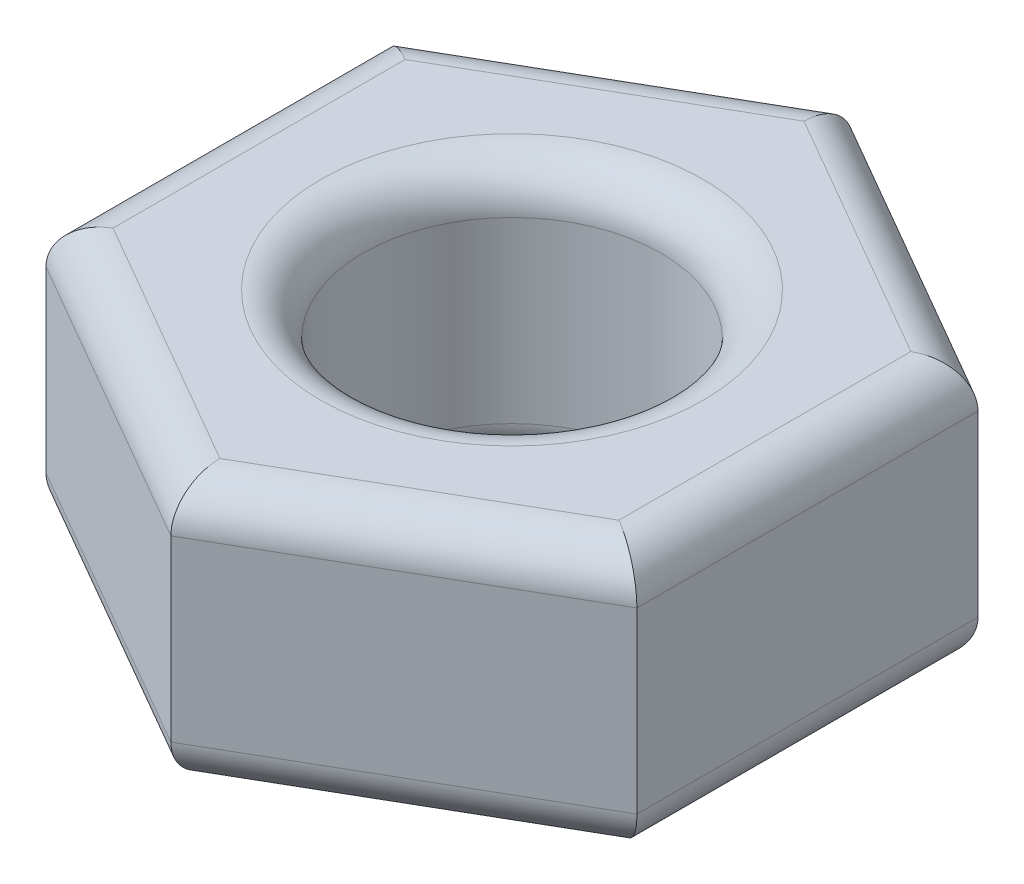
ISO-10303-21;
HEADER;
FILE_DESCRIPTION(('STEP AP214'),'2;1');
FILE_NAME('part.step','',(''),(''),'','','');
FILE_SCHEMA(('AUTOMOTIVE_DESIGN { 1 0 10303 214 1 1 1 1 }'));
ENDSEC;
DATA;
#1=APPLICATION_CONTEXT('core data for automotive mechanical design processes');
#2=APPLICATION_PROTOCOL_DEFINITION('international standard','automotive_design',2000,#1);
#3=PRODUCT_CONTEXT('',#1,'mechanical');
#4=PRODUCT('Part','Part','',(#3));
#5=PRODUCT_RELATED_PRODUCT_CATEGORY('part','',(#4));
#6=PRODUCT_DEFINITION_FORMATION('','',#4);
#7=PRODUCT_DEFINITION_CONTEXT('part definition',#1,'design');
#8=PRODUCT_DEFINITION('design','',#6,#7);
#9=PRODUCT_DEFINITION_SHAPE('','',#8);
#10=(LENGTH_UNIT() NAMED_UNIT(*) SI_UNIT(.MILLI.,.METRE.));
#11=(NAMED_UNIT(*) PLANE_ANGLE_UNIT() SI_UNIT($,.RADIAN.));
#12=(NAMED_UNIT(*) SI_UNIT($,.STERADIAN.) SOLID_ANGLE_UNIT());
#13=UNCERTAINTY_MEASURE_WITH_UNIT(LENGTH_MEASURE(1.E-05),#10,'distance_accuracy_value','');
#14=(GEOMETRIC_REPRESENTATION_CONTEXT(3) GLOBAL_UNCERTAINTY_ASSIGNED_CONTEXT((#13)) GLOBAL_UNIT_ASSIGNED_CONTEXT((#10,
#11,#12)) REPRESENTATION_CONTEXT('',''));
#15=CARTESIAN_POINT('',(0.,0.,0.));
#16=DIRECTION('',(0.,0.,1.));
#17=DIRECTION('',(1.,0.,0.));
#18=AXIS2_PLACEMENT_3D('',#15,#16,#17);
#19=CARTESIAN_POINT('',(0.,3.1,0.));
#20=DIRECTION('',(0.,1.,0.));
#21=DIRECTION('',(0.,0.,1.));
#22=AXIS2_PLACEMENT_3D('',#19,#20,#21);
#23=PLANE('',#22);
#24=CARTESIAN_POINT('',(0.,3.1,0.));
#25=DIRECTION('',(0.,1.,0.));
#26=DIRECTION('',(0.,0.,1.));
#27=AXIS2_PLACEMENT_3D('',#24,#25,#26);
#28=CIRCLE('',#27,2.25);
#29=CARTESIAN_POINT('',(0.,3.1,2.25));
#30=VERTEX_POINT('',#29);
#31=EDGE_CURVE('E148',#30,#30,#28,.F.);
#32=ORIENTED_EDGE('',*,*,#31,.T.);
#33=EDGE_LOOP('',(#32));
#34=FACE_BOUND('',#33,.T.);
#35=DIRECTION('',(-0.866025403784439,0.,0.5));
#36=VECTOR('',#35,1.);
#37=CARTESIAN_POINT('',(-3.225,3.1,-1.57327948354173));
#38=LINE('',#37,#36);
#39=CARTESIAN_POINT('',(0.,3.1,-3.43523410167828));
#40=VERTEX_POINT('',#39);
#41=CARTESIAN_POINT('',(-2.975,3.1,-1.71761705083914));
#42=VERTEX_POINT('',#41);
#43=EDGE_CURVE('E146',#40,#42,#38,.T.);
#44=ORIENTED_EDGE('',*,*,#43,.T.);
#45=DIRECTION('',(0.,0.,1.));
#46=VECTOR('',#45,1.);
#47=CARTESIAN_POINT('',(-2.975,3.1,2.00629218543395));
#48=LINE('',#47,#46);
#49=CARTESIAN_POINT('',(-2.975,3.1,1.71761705083914));
#50=VERTEX_POINT('',#49);
#51=EDGE_CURVE('E128',#42,#50,#48,.T.);
#52=ORIENTED_EDGE('',*,*,#51,.T.);
#53=DIRECTION('',(0.866025403784439,0.,0.5));
#54=VECTOR('',#53,1.);
#55=CARTESIAN_POINT('',(0.249999999999999,3.1,3.57957166897568));
#56=LINE('',#55,#54);
#57=CARTESIAN_POINT('',(0.,3.1,3.43523410167828));
#58=VERTEX_POINT('',#57);
#59=EDGE_CURVE('E136',#50,#58,#56,.T.);
#60=ORIENTED_EDGE('',*,*,#59,.T.);
#61=DIRECTION('',(0.866025403784438,0.,-0.5));
#62=VECTOR('',#61,1.);
#63=CARTESIAN_POINT('',(3.225,3.1,1.57327948354173));
#64=LINE('',#63,#62);
#65=CARTESIAN_POINT('',(2.975,3.1,1.71761705083914));
#66=VERTEX_POINT('',#65);
#67=EDGE_CURVE('E142',#58,#66,#64,.T.);
#68=ORIENTED_EDGE('',*,*,#67,.T.);
#69=DIRECTION('',(0.,0.,-1.));
#70=VECTOR('',#69,1.);
#71=CARTESIAN_POINT('',(2.975,3.1,-2.00629218543396));
#72=LINE('',#71,#70);
#73=CARTESIAN_POINT('',(2.975,3.1,-1.71761705083915));
#74=VERTEX_POINT('',#73);
#75=EDGE_CURVE('E256',#66,#74,#72,.T.);
#76=ORIENTED_EDGE('',*,*,#75,.T.);
#77=DIRECTION('',(-0.866025403784439,0.,-0.5));
#78=VECTOR('',#77,1.);
#79=CARTESIAN_POINT('',(-0.249999999999994,3.1,-3.57957166897568));
#80=LINE('',#79,#78);
#81=EDGE_CURVE('E153',#74,#40,#80,.T.);
#82=ORIENTED_EDGE('',*,*,#81,.T.);
#83=EDGE_LOOP('',(#44,#52,#60,#68,#76,#82));
#84=FACE_BOUND('',#83,.T.);
#85=ADVANCED_FACE('F32',(#34,#84),#23,.T.);
#86=CARTESIAN_POINT('',(0.,0.,0.));
#87=DIRECTION('',(0.,1.,0.));
#88=DIRECTION('',(0.,0.,1.));
#89=AXIS2_PLACEMENT_3D('',#86,#87,#88);
#90=PLANE('',#89);
#91=CARTESIAN_POINT('',(0.,0.,0.));
#92=DIRECTION('',(0.,1.,0.));
#93=DIRECTION('',(0.,0.,1.));
#94=AXIS2_PLACEMENT_3D('',#91,#92,#93);
#95=CIRCLE('',#94,2.25);
#96=CARTESIAN_POINT('',(0.,0.,2.25));
#97=VERTEX_POINT('',#96);
#98=EDGE_CURVE('E11',#97,#97,#95,.T.);
#99=ORIENTED_EDGE('',*,*,#98,.T.);
#100=EDGE_LOOP('',(#99));
#101=FACE_BOUND('',#100,.T.);
#102=DIRECTION('',(0.,0.,-1.));
#103=VECTOR('',#102,1.);
#104=CARTESIAN_POINT('',(2.975,0.,0.));
#105=LINE('',#104,#103);
#106=CARTESIAN_POINT('',(2.975,0.,-1.71761705083915));
#107=VERTEX_POINT('',#106);
#108=CARTESIAN_POINT('',(2.975,0.,1.71761705083914));
#109=VERTEX_POINT('',#108);
#110=EDGE_CURVE('E49',#107,#109,#105,.F.);
#111=ORIENTED_EDGE('',*,*,#110,.T.);
#112=DIRECTION('',(0.866025403784438,0.,-0.5));
#113=VECTOR('',#112,1.);
#114=CARTESIAN_POINT('',(1.4875,0.,2.5764255762587));
#115=LINE('',#114,#113);
#116=CARTESIAN_POINT('',(0.,0.,3.43523410167828));
#117=VERTEX_POINT('',#116);
#118=EDGE_CURVE('E41',#109,#117,#115,.F.);
#119=ORIENTED_EDGE('',*,*,#118,.T.);
#120=DIRECTION('',(0.866025403784439,0.,0.5));
#121=VECTOR('',#120,1.);
#122=CARTESIAN_POINT('',(-1.4875,0.,2.57642557625871));
#123=LINE('',#122,#121);
#124=CARTESIAN_POINT('',(-2.975,0.,1.71761705083914));
#125=VERTEX_POINT('',#124);
#126=EDGE_CURVE('E180',#117,#125,#123,.F.);
#127=ORIENTED_EDGE('',*,*,#126,.T.);
#128=DIRECTION('',(0.,0.,1.));
#129=VECTOR('',#128,1.);
#130=CARTESIAN_POINT('',(-2.975,0.,0.));
#131=LINE('',#130,#129);
#132=CARTESIAN_POINT('',(-2.975,0.,-1.71761705083914));
#133=VERTEX_POINT('',#132);
#134=EDGE_CURVE('E182',#125,#133,#131,.F.);
#135=ORIENTED_EDGE('',*,*,#134,.T.);
#136=DIRECTION('',(-0.866025403784439,0.,0.5));
#137=VECTOR('',#136,1.);
#138=CARTESIAN_POINT('',(-1.4875,0.,-2.57642557625871));
#139=LINE('',#138,#137);
#140=CARTESIAN_POINT('',(0.,0.,-3.43523410167828));
#141=VERTEX_POINT('',#140);
#142=EDGE_CURVE('E184',#133,#141,#139,.F.);
#143=ORIENTED_EDGE('',*,*,#142,.T.);
#144=DIRECTION('',(-0.866025403784439,0.,-0.5));
#145=VECTOR('',#144,1.);
#146=CARTESIAN_POINT('',(1.4875,0.,-2.57642557625871));
#147=LINE('',#146,#145);
#148=EDGE_CURVE('E54',#141,#107,#147,.F.);
#149=ORIENTED_EDGE('',*,*,#148,.T.);
#150=EDGE_LOOP('',(#111,#119,#127,#135,#143,#149));
#151=FACE_BOUND('',#150,.T.);
#152=ADVANCED_FACE('F225',(#101,#151),#90,.F.);
#153=CARTESIAN_POINT('',(-3.475,3.1,2.00629218543395));
#154=DIRECTION('',(0.5,0.,-0.866025403784438));
#155=DIRECTION('',(-0.866025403784439,0.,-0.5));
#156=AXIS2_PLACEMENT_3D('',#153,#154,#155);
#157=PLANE('',#156);
#158=DIRECTION('',(0.,-1.,0.));
#159=VECTOR('',#158,1.);
#160=CARTESIAN_POINT('',(0.,3.1,4.0125843708679));
#161=LINE('',#160,#159);
#162=CARTESIAN_POINT('',(0.,2.6,4.0125843708679));
#163=VERTEX_POINT('',#162);
#164=CARTESIAN_POINT('',(0.,0.500000000000001,4.0125843708679));
#165=VERTEX_POINT('',#164);
#166=EDGE_CURVE('E237',#163,#165,#161,.T.);
#167=ORIENTED_EDGE('',*,*,#166,.F.);
#168=DIRECTION('',(0.866025403784439,0.,0.5));
#169=VECTOR('',#168,1.);
#170=CARTESIAN_POINT('',(-3.475,2.6,2.00629218543395));
#171=LINE('',#170,#169);
#172=CARTESIAN_POINT('',(-3.475,2.6,2.00629218543395));
#173=VERTEX_POINT('',#172);
#174=EDGE_CURVE('E178',#163,#173,#171,.F.);
#175=ORIENTED_EDGE('',*,*,#174,.T.);
#176=DIRECTION('',(0.,-1.,0.));
#177=VECTOR('',#176,1.);
#178=CARTESIAN_POINT('',(-3.475,3.1,2.00629218543395));
#179=LINE('',#178,#177);
#180=CARTESIAN_POINT('',(-3.475,0.500000000000001,2.00629218543395));
#181=VERTEX_POINT('',#180);
#182=EDGE_CURVE('E200',#173,#181,#179,.T.);
#183=ORIENTED_EDGE('',*,*,#182,.T.);
#184=DIRECTION('',(0.866025403784439,0.,0.5));
#185=VECTOR('',#184,1.);
#186=CARTESIAN_POINT('',(-3.475,0.5,2.00629218543395));
#187=LINE('',#186,#185);
#188=EDGE_CURVE('E176',#181,#165,#187,.T.);
#189=ORIENTED_EDGE('',*,*,#188,.T.);
#190=EDGE_LOOP('',(#167,#175,#183,#189));
#191=FACE_BOUND('',#190,.T.);
#192=ADVANCED_FACE('F236',(#191),#157,.F.);
#193=CARTESIAN_POINT('',(0.,3.1,4.0125843708679));
#194=DIRECTION('',(-0.5,0.,-0.866025403784438));
#195=DIRECTION('',(-0.866025403784438,0.,0.5));
#196=AXIS2_PLACEMENT_3D('',#193,#194,#195);
#197=PLANE('',#196);
#198=DIRECTION('',(0.,-1.,0.));
#199=VECTOR('',#198,1.);
#200=CARTESIAN_POINT('',(3.475,3.1,2.00629218543395));
#201=LINE('',#200,#199);
#202=CARTESIAN_POINT('',(3.475,2.6,2.00629218543395));
#203=VERTEX_POINT('',#202);
#204=CARTESIAN_POINT('',(3.475,0.500000000000001,2.00629218543395));
#205=VERTEX_POINT('',#204);
#206=EDGE_CURVE('E245',#203,#205,#201,.T.);
#207=ORIENTED_EDGE('',*,*,#206,.F.);
#208=DIRECTION('',(0.866025403784438,0.,-0.5));
#209=VECTOR('',#208,1.);
#210=CARTESIAN_POINT('',(0.,2.6,4.0125843708679));
#211=LINE('',#210,#209);
#212=EDGE_CURVE('E174',#203,#163,#211,.F.);
#213=ORIENTED_EDGE('',*,*,#212,.T.);
#214=ORIENTED_EDGE('',*,*,#166,.T.);
#215=DIRECTION('',(0.866025403784438,0.,-0.5));
#216=VECTOR('',#215,1.);
#217=CARTESIAN_POINT('',(0.,0.5,4.0125843708679));
#218=LINE('',#217,#216);
#219=EDGE_CURVE('E171',#165,#205,#218,.T.);
#220=ORIENTED_EDGE('',*,*,#219,.T.);
#221=EDGE_LOOP('',(#207,#213,#214,#220));
#222=FACE_BOUND('',#221,.T.);
#223=ADVANCED_FACE('F241',(#222),#197,.F.);
#224=CARTESIAN_POINT('',(3.475,3.1,2.00629218543395));
#225=DIRECTION('',(-1.,0.,0.));
#226=DIRECTION('',(0.,0.,1.));
#227=AXIS2_PLACEMENT_3D('',#224,#225,#226);
#228=PLANE('',#227);
#229=DIRECTION('',(0.,-1.,0.));
#230=VECTOR('',#229,1.);
#231=CARTESIAN_POINT('',(3.475,3.1,-2.00629218543396));
#232=LINE('',#231,#230);
#233=CARTESIAN_POINT('',(3.475,2.6,-2.00629218543396));
#234=VERTEX_POINT('',#233);
#235=CARTESIAN_POINT('',(3.475,0.500000000000001,-2.00629218543396));
#236=VERTEX_POINT('',#235);
#237=EDGE_CURVE('E249',#234,#236,#232,.T.);
#238=ORIENTED_EDGE('',*,*,#237,.F.);
#239=DIRECTION('',(0.,0.,-1.));
#240=VECTOR('',#239,1.);
#241=CARTESIAN_POINT('',(3.475,2.6,2.00629218543395));
#242=LINE('',#241,#240);
#243=EDGE_CURVE('E169',#234,#203,#242,.F.);
#244=ORIENTED_EDGE('',*,*,#243,.T.);
#245=ORIENTED_EDGE('',*,*,#206,.T.);
#246=DIRECTION('',(0.,0.,-1.));
#247=VECTOR('',#246,1.);
#248=CARTESIAN_POINT('',(3.475,0.5,2.00629218543395));
#249=LINE('',#248,#247);
#250=EDGE_CURVE('E167',#205,#236,#249,.T.);
#251=ORIENTED_EDGE('',*,*,#250,.T.);
#252=EDGE_LOOP('',(#238,#244,#245,#251));
#253=FACE_BOUND('',#252,.T.);
#254=ADVANCED_FACE('F317',(#253),#228,.F.);
#255=CARTESIAN_POINT('',(3.475,3.1,-2.00629218543396));
#256=DIRECTION('',(-0.5,0.,0.866025403784439));
#257=DIRECTION('',(0.866025403784439,0.,0.5));
#258=AXIS2_PLACEMENT_3D('',#255,#256,#257);
#259=PLANE('',#258);
#260=DIRECTION('',(0.,-1.,0.));
#261=VECTOR('',#260,1.);
#262=CARTESIAN_POINT('',(0.,3.1,-4.0125843708679));
#263=LINE('',#262,#261);
#264=CARTESIAN_POINT('',(0.,2.6,-4.0125843708679));
#265=VERTEX_POINT('',#264);
#266=CARTESIAN_POINT('',(0.,0.500000000000001,-4.0125843708679));
#267=VERTEX_POINT('',#266);
#268=EDGE_CURVE('E276',#265,#267,#263,.T.);
#269=ORIENTED_EDGE('',*,*,#268,.F.);
#270=DIRECTION('',(-0.866025403784439,0.,-0.5));
#271=VECTOR('',#270,1.);
#272=CARTESIAN_POINT('',(3.475,2.6,-2.00629218543396));
#273=LINE('',#272,#271);
#274=EDGE_CURVE('E165',#265,#234,#273,.F.);
#275=ORIENTED_EDGE('',*,*,#274,.T.);
#276=ORIENTED_EDGE('',*,*,#237,.T.);
#277=DIRECTION('',(-0.866025403784439,0.,-0.5));
#278=VECTOR('',#277,1.);
#279=CARTESIAN_POINT('',(3.475,0.5,-2.00629218543396));
#280=LINE('',#279,#278);
#281=EDGE_CURVE('E163',#236,#267,#280,.T.);
#282=ORIENTED_EDGE('',*,*,#281,.T.);
#283=EDGE_LOOP('',(#269,#275,#276,#282));
#284=FACE_BOUND('',#283,.T.);
#285=ADVANCED_FACE('F283',(#284),#259,.F.);
#286=CARTESIAN_POINT('',(0.,3.1,-4.0125843708679));
#287=DIRECTION('',(0.5,0.,0.866025403784439));
#288=DIRECTION('',(0.866025403784439,0.,-0.5));
#289=AXIS2_PLACEMENT_3D('',#286,#287,#288);
#290=PLANE('',#289);
#291=DIRECTION('',(0.,-1.,0.));
#292=VECTOR('',#291,1.);
#293=CARTESIAN_POINT('',(-3.475,3.1,-2.00629218543395));
#294=LINE('',#293,#292);
#295=CARTESIAN_POINT('',(-3.475,2.6,-2.00629218543395));
#296=VERTEX_POINT('',#295);
#297=CARTESIAN_POINT('',(-3.475,0.500000000000001,-2.00629218543395));
#298=VERTEX_POINT('',#297);
#299=EDGE_CURVE('E274',#296,#298,#294,.T.);
#300=ORIENTED_EDGE('',*,*,#299,.F.);
#301=DIRECTION('',(-0.866025403784439,0.,0.5));
#302=VECTOR('',#301,1.);
#303=CARTESIAN_POINT('',(0.,2.6,-4.0125843708679));
#304=LINE('',#303,#302);
#305=EDGE_CURVE('E161',#296,#265,#304,.F.);
#306=ORIENTED_EDGE('',*,*,#305,.T.);
#307=ORIENTED_EDGE('',*,*,#268,.T.);
#308=DIRECTION('',(-0.866025403784439,0.,0.5));
#309=VECTOR('',#308,1.);
#310=CARTESIAN_POINT('',(0.,0.5,-4.0125843708679));
#311=LINE('',#310,#309);
#312=EDGE_CURVE('E159',#267,#298,#311,.T.);
#313=ORIENTED_EDGE('',*,*,#312,.T.);
#314=EDGE_LOOP('',(#300,#306,#307,#313));
#315=FACE_BOUND('',#314,.T.);
#316=ADVANCED_FACE('F275',(#315),#290,.F.);
#317=CARTESIAN_POINT('',(-3.475,3.1,-2.00629218543395));
#318=DIRECTION('',(1.,0.,0.));
#319=DIRECTION('',(0.,0.,-1.));
#320=AXIS2_PLACEMENT_3D('',#317,#318,#319);
#321=PLANE('',#320);
#322=ORIENTED_EDGE('',*,*,#182,.F.);
#323=DIRECTION('',(0.,0.,1.));
#324=VECTOR('',#323,1.);
#325=CARTESIAN_POINT('',(-3.475,2.6,-2.00629218543395));
#326=LINE('',#325,#324);
#327=EDGE_CURVE('E130',#173,#296,#326,.F.);
#328=ORIENTED_EDGE('',*,*,#327,.T.);
#329=ORIENTED_EDGE('',*,*,#299,.T.);
#330=DIRECTION('',(0.,0.,1.));
#331=VECTOR('',#330,1.);
#332=CARTESIAN_POINT('',(-3.475,0.5,-2.00629218543395));
#333=LINE('',#332,#331);
#334=EDGE_CURVE('E151',#298,#181,#333,.T.);
#335=ORIENTED_EDGE('',*,*,#334,.T.);
#336=EDGE_LOOP('',(#322,#328,#329,#335));
#337=FACE_BOUND('',#336,.T.);
#338=ADVANCED_FACE('F273',(#337),#321,.F.);
#339=CARTESIAN_POINT('',(0.,3.1,0.));
#340=DIRECTION('',(0.,-1.,0.));
#341=DIRECTION('',(0.,0.,-1.));
#342=AXIS2_PLACEMENT_3D('',#339,#340,#341);
#343=CYLINDRICAL_SURFACE('',#342,1.75);
#344=CARTESIAN_POINT('',(0.,2.6,0.));
#345=DIRECTION('',(0.,1.,0.));
#346=DIRECTION('',(0.,0.,1.));
#347=AXIS2_PLACEMENT_3D('',#344,#345,#346);
#348=CIRCLE('',#347,1.75);
#349=CARTESIAN_POINT('',(0.,2.6,-1.75));
#350=VERTEX_POINT('',#349);
#351=EDGE_CURVE('E143',#350,#350,#348,.T.);
#352=CARTESIAN_POINT('',(0.,0.5,0.));
#353=DIRECTION('',(0.,1.,0.));
#354=DIRECTION('',(0.,0.,1.));
#355=AXIS2_PLACEMENT_3D('',#352,#353,#354);
#356=CIRCLE('',#355,1.75);
#357=CARTESIAN_POINT('',(0.,0.5,-1.75));
#358=VERTEX_POINT('',#357);
#359=EDGE_CURVE('E244',#358,#358,#356,.F.);
#360=CARTESIAN_POINT('',(0.,2.6,-1.75));
#361=CARTESIAN_POINT('',(0.,2.578125,-1.75));
#362=CARTESIAN_POINT('',(0.,2.55625,-1.75));
#363=CARTESIAN_POINT('',(0.,2.5125,-1.75));
#364=CARTESIAN_POINT('',(0.,2.490625,-1.75));
#365=CARTESIAN_POINT('',(0.,2.446875,-1.75));
#366=CARTESIAN_POINT('',(0.,2.425,-1.75));
#367=CARTESIAN_POINT('',(0.,2.38125,-1.75));
#368=CARTESIAN_POINT('',(0.,2.359375,-1.75));
#369=CARTESIAN_POINT('',(0.,2.315625,-1.75));
#370=CARTESIAN_POINT('',(0.,2.29375,-1.75));
#371=CARTESIAN_POINT('',(0.,2.25,-1.75));
#372=CARTESIAN_POINT('',(0.,2.228125,-1.75));
#373=CARTESIAN_POINT('',(0.,2.184375,-1.75));
#374=CARTESIAN_POINT('',(0.,2.1625,-1.75));
#375=CARTESIAN_POINT('',(0.,2.11875,-1.75));
#376=CARTESIAN_POINT('',(0.,2.096875,-1.75));
#377=CARTESIAN_POINT('',(0.,2.053125,-1.75));
#378=CARTESIAN_POINT('',(0.,2.03125,-1.75));
#379=CARTESIAN_POINT('',(0.,1.9875,-1.75));
#380=CARTESIAN_POINT('',(0.,1.965625,-1.75));
#381=CARTESIAN_POINT('',(0.,1.921875,-1.75));
#382=CARTESIAN_POINT('',(0.,1.9,-1.75));
#383=CARTESIAN_POINT('',(0.,1.85625,-1.75));
#384=CARTESIAN_POINT('',(0.,1.834375,-1.75));
#385=CARTESIAN_POINT('',(0.,1.790625,-1.75));
#386=CARTESIAN_POINT('',(0.,1.76875,-1.75));
#387=CARTESIAN_POINT('',(0.,1.725,-1.75));
#388=CARTESIAN_POINT('',(0.,1.703125,-1.75));
#389=CARTESIAN_POINT('',(0.,1.659375,-1.75));
#390=CARTESIAN_POINT('',(0.,1.6375,-1.75));
#391=CARTESIAN_POINT('',(0.,1.59375,-1.75));
#392=CARTESIAN_POINT('',(0.,1.571875,-1.75));
#393=CARTESIAN_POINT('',(0.,1.528125,-1.75));
#394=CARTESIAN_POINT('',(0.,1.50625,-1.75));
#395=CARTESIAN_POINT('',(0.,1.4625,-1.75));
#396=CARTESIAN_POINT('',(0.,1.440625,-1.75));
#397=CARTESIAN_POINT('',(0.,1.396875,-1.75));
#398=CARTESIAN_POINT('',(0.,1.375,-1.75));
#399=CARTESIAN_POINT('',(0.,1.33125,-1.75));
#400=CARTESIAN_POINT('',(0.,1.309375,-1.75));
#401=CARTESIAN_POINT('',(0.,1.265625,-1.75));
#402=CARTESIAN_POINT('',(0.,1.24375,-1.75));
#403=CARTESIAN_POINT('',(0.,1.2,-1.75));
#404=CARTESIAN_POINT('',(0.,1.178125,-1.75));
#405=CARTESIAN_POINT('',(0.,1.134375,-1.75));
#406=CARTESIAN_POINT('',(0.,1.1125,-1.75));
#407=CARTESIAN_POINT('',(0.,1.06875,-1.75));
#408=CARTESIAN_POINT('',(0.,1.046875,-1.75));
#409=CARTESIAN_POINT('',(0.,1.003125,-1.75));
#410=CARTESIAN_POINT('',(0.,0.98125,-1.75));
#411=CARTESIAN_POINT('',(0.,0.9375,-1.75));
#412=CARTESIAN_POINT('',(0.,0.915625,-1.75));
#413=CARTESIAN_POINT('',(0.,0.871875,-1.75));
#414=CARTESIAN_POINT('',(0.,0.85,-1.75));
#415=CARTESIAN_POINT('',(0.,0.80625,-1.75));
#416=CARTESIAN_POINT('',(0.,0.784375,-1.75));
#417=CARTESIAN_POINT('',(0.,0.740625,-1.75));
#418=CARTESIAN_POINT('',(0.,0.71875,-1.75));
#419=CARTESIAN_POINT('',(0.,0.674999999999999,-1.75));
#420=CARTESIAN_POINT('',(0.,0.653125,-1.75));
#421=CARTESIAN_POINT('',(0.,0.609375,-1.75));
#422=CARTESIAN_POINT('',(0.,0.5875,-1.75));
#423=CARTESIAN_POINT('',(0.,0.54375,-1.75));
#424=CARTESIAN_POINT('',(0.,0.521875,-1.75));
#425=CARTESIAN_POINT('',(0.,0.5,-1.75));
#426=B_SPLINE_CURVE_WITH_KNOTS('',3,(#360,#361,#362,#363,#364,#365,#366,#367,#368,#369,#370,
#371,#372,#373,#374,#375,#376,#377,#378,#379,#380,#381,#382,#383,#384,#385,#386,#387,#388,#389,
#390,#391,#392,#393,#394,#395,#396,#397,#398,#399,#400,#401,#402,#403,#404,#405,#406,#407,#408,
#409,#410,#411,#412,#413,#414,#415,#416,#417,#418,#419,#420,#421,#422,#423,#424,#425),
.UNSPECIFIED.,.F.,.F.,(4,2,2,2,2,2,2,2,2,2,2,2,2,2,2,2,2,2,2,2,2,2,2,2,2,2,2,2,2,2,2,2,4),(0.,
0.0656250000000001,0.13125,0.196875,0.2625,0.328125,0.39375,0.459375,0.525,0.590625,0.65625,
0.721875,0.7875,0.853125,0.91875,0.984375,1.05,1.115625,1.18125,1.246875,1.3125,1.378125,
1.44375,1.509375,1.575,1.640625,1.70625,1.771875,1.8375,1.903125,1.96875,2.034375,2.1),.UNSPECIFIED.);
#427=EDGE_CURVE('BSEAM309',#350,#358,#426,.T.);
#428=ORIENTED_EDGE('',*,*,#351,.T.);
#429=ORIENTED_EDGE('',*,*,#359,.T.);
#430=ORIENTED_EDGE('',*,*,#427,.T.);
#431=ORIENTED_EDGE('',*,*,#427,.F.);
#432=EDGE_LOOP('',(#428,#430,#429,#431));
#433=FACE_BOUND('',#432,.T.);
#434=ADVANCED_FACE('F309',(#433),#343,.F.);
#435=CARTESIAN_POINT('',(0.,2.6,0.));
#436=DIRECTION('',(0.,1.,0.));
#437=DIRECTION('',(0.,0.,1.));
#438=AXIS2_PLACEMENT_3D('',#435,#436,#437);
#439=TOROIDAL_SURFACE('',#438,2.25,0.5);
#440=ORIENTED_EDGE('',*,*,#31,.F.);
#441=EDGE_LOOP('',(#440));
#442=FACE_BOUND('',#441,.T.);
#443=ORIENTED_EDGE('',*,*,#351,.F.);
#444=EDGE_LOOP('',(#443));
#445=FACE_BOUND('',#444,.T.);
#446=ADVANCED_FACE('F324',(#442,#445),#439,.T.);
#447=CARTESIAN_POINT('',(2.975,2.6,0.));
#448=DIRECTION('',(0.,0.,1.));
#449=DIRECTION('',(1.,0.,0.));
#450=AXIS2_PLACEMENT_3D('',#447,#448,#449);
#451=CYLINDRICAL_SURFACE('',#450,0.5);
#452=CARTESIAN_POINT('',(2.975,2.6,1.71761705083914));
#453=DIRECTION('',(-0.5,0.,0.866025403784439));
#454=DIRECTION('',(-0.866025403784439,0.,-0.5));
#455=AXIS2_PLACEMENT_3D('',#452,#453,#454);
#456=ELLIPSE('',#455,0.577350269189626,0.5);
#457=EDGE_CURVE('E194',#203,#66,#456,.T.);
#458=ORIENTED_EDGE('',*,*,#457,.F.);
#459=ORIENTED_EDGE('',*,*,#243,.F.);
#460=CARTESIAN_POINT('',(2.975,2.6,-1.71761705083915));
#461=DIRECTION('',(0.5,0.,0.866025403784439));
#462=DIRECTION('',(-0.866025403784439,0.,0.5));
#463=AXIS2_PLACEMENT_3D('',#460,#461,#462);
#464=ELLIPSE('',#463,0.577350269189626,0.5);
#465=EDGE_CURVE('E197',#74,#234,#464,.F.);
#466=ORIENTED_EDGE('',*,*,#465,.F.);
#467=ORIENTED_EDGE('',*,*,#75,.F.);
#468=EDGE_LOOP('',(#458,#459,#466,#467));
#469=FACE_BOUND('',#468,.T.);
#470=ADVANCED_FACE('F327',(#469),#451,.T.);
#471=CARTESIAN_POINT('',(1.4875,2.6,-2.57642557625871));
#472=DIRECTION('',(0.866025403784439,0.,0.5));
#473=DIRECTION('',(0.5,0.,-0.866025403784439));
#474=AXIS2_PLACEMENT_3D('',#471,#472,#473);
#475=CYLINDRICAL_SURFACE('',#474,0.5);
#476=ORIENTED_EDGE('',*,*,#465,.T.);
#477=ORIENTED_EDGE('',*,*,#274,.F.);
#478=CARTESIAN_POINT('',(0.,2.6,-3.43523410167828));
#479=DIRECTION('',(1.,0.,0.));
#480=DIRECTION('',(0.,0.,1.));
#481=AXIS2_PLACEMENT_3D('',#478,#479,#480);
#482=ELLIPSE('',#481,0.577350269189626,0.5);
#483=EDGE_CURVE('E191',#40,#265,#482,.F.);
#484=ORIENTED_EDGE('',*,*,#483,.F.);
#485=ORIENTED_EDGE('',*,*,#81,.F.);
#486=EDGE_LOOP('',(#476,#477,#484,#485));
#487=FACE_BOUND('',#486,.T.);
#488=ADVANCED_FACE('F263',(#487),#475,.T.);
#489=CARTESIAN_POINT('',(1.4875,2.6,2.5764255762587));
#490=DIRECTION('',(-0.866025403784438,0.,0.5));
#491=DIRECTION('',(0.5,0.,0.866025403784438));
#492=AXIS2_PLACEMENT_3D('',#489,#490,#491);
#493=CYLINDRICAL_SURFACE('',#492,0.5);
#494=ORIENTED_EDGE('',*,*,#457,.T.);
#495=ORIENTED_EDGE('',*,*,#67,.F.);
#496=CARTESIAN_POINT('',(0.,2.6,3.43523410167828));
#497=DIRECTION('',(-1.,0.,0.));
#498=DIRECTION('',(0.,0.,-1.));
#499=AXIS2_PLACEMENT_3D('',#496,#497,#498);
#500=ELLIPSE('',#499,0.577350269189626,0.5);
#501=EDGE_CURVE('E139',#163,#58,#500,.T.);
#502=ORIENTED_EDGE('',*,*,#501,.F.);
#503=ORIENTED_EDGE('',*,*,#212,.F.);
#504=EDGE_LOOP('',(#494,#495,#502,#503));
#505=FACE_BOUND('',#504,.T.);
#506=ADVANCED_FACE('F336',(#505),#493,.T.);
#507=CARTESIAN_POINT('',(-1.4875,2.6,-2.57642557625871));
#508=DIRECTION('',(0.866025403784439,0.,-0.5));
#509=DIRECTION('',(-0.5,0.,-0.866025403784439));
#510=AXIS2_PLACEMENT_3D('',#507,#508,#509);
#511=CYLINDRICAL_SURFACE('',#510,0.5);
#512=ORIENTED_EDGE('',*,*,#483,.T.);
#513=ORIENTED_EDGE('',*,*,#305,.F.);
#514=CARTESIAN_POINT('',(-2.975,2.6,-1.71761705083914));
#515=DIRECTION('',(0.5,0.,-0.866025403784438));
#516=DIRECTION('',(0.866025403784439,0.,0.5));
#517=AXIS2_PLACEMENT_3D('',#514,#515,#516);
#518=ELLIPSE('',#517,0.577350269189626,0.5);
#519=EDGE_CURVE('E133',#42,#296,#518,.F.);
#520=ORIENTED_EDGE('',*,*,#519,.F.);
#521=ORIENTED_EDGE('',*,*,#43,.F.);
#522=EDGE_LOOP('',(#512,#513,#520,#521));
#523=FACE_BOUND('',#522,.T.);
#524=ADVANCED_FACE('F266',(#523),#511,.T.);
#525=CARTESIAN_POINT('',(-1.4875,2.6,2.57642557625871));
#526=DIRECTION('',(-0.866025403784439,0.,-0.5));
#527=DIRECTION('',(-0.5,0.,0.866025403784438));
#528=AXIS2_PLACEMENT_3D('',#525,#526,#527);
#529=CYLINDRICAL_SURFACE('',#528,0.5);
#530=ORIENTED_EDGE('',*,*,#501,.T.);
#531=ORIENTED_EDGE('',*,*,#59,.F.);
#532=CARTESIAN_POINT('',(-2.975,2.6,1.71761705083914));
#533=DIRECTION('',(-0.5,0.,-0.866025403784439));
#534=DIRECTION('',(-0.866025403784439,0.,0.5));
#535=AXIS2_PLACEMENT_3D('',#532,#533,#534);
#536=ELLIPSE('',#535,0.577350269189626,0.5);
#537=EDGE_CURVE('E124',#173,#50,#536,.T.);
#538=ORIENTED_EDGE('',*,*,#537,.F.);
#539=ORIENTED_EDGE('',*,*,#174,.F.);
#540=EDGE_LOOP('',(#530,#531,#538,#539));
#541=FACE_BOUND('',#540,.T.);
#542=ADVANCED_FACE('F137',(#541),#529,.T.);
#543=CARTESIAN_POINT('',(-2.975,2.6,0.));
#544=DIRECTION('',(0.,0.,-1.));
#545=DIRECTION('',(-1.,0.,0.));
#546=AXIS2_PLACEMENT_3D('',#543,#544,#545);
#547=CYLINDRICAL_SURFACE('',#546,0.5);
#548=ORIENTED_EDGE('',*,*,#519,.T.);
#549=ORIENTED_EDGE('',*,*,#327,.F.);
#550=ORIENTED_EDGE('',*,*,#537,.T.);
#551=ORIENTED_EDGE('',*,*,#51,.F.);
#552=EDGE_LOOP('',(#548,#549,#550,#551));
#553=FACE_BOUND('',#552,.T.);
#554=ADVANCED_FACE('F126',(#553),#547,.T.);
#555=CARTESIAN_POINT('',(0.,0.5,0.));
#556=DIRECTION('',(0.,1.,0.));
#557=DIRECTION('',(0.,0.,1.));
#558=AXIS2_PLACEMENT_3D('',#555,#556,#557);
#559=TOROIDAL_SURFACE('',#558,2.25,0.5);
#560=ORIENTED_EDGE('',*,*,#359,.F.);
#561=EDGE_LOOP('',(#560));
#562=FACE_BOUND('',#561,.T.);
#563=ORIENTED_EDGE('',*,*,#98,.F.);
#564=EDGE_LOOP('',(#563));
#565=FACE_BOUND('',#564,.T.);
#566=ADVANCED_FACE('F331',(#562,#565),#559,.T.);
#567=CARTESIAN_POINT('',(0.250000000000007,0.5,-3.57957166897568));
#568=DIRECTION('',(-0.866025403784439,0.,0.5));
#569=DIRECTION('',(0.5,0.,0.866025403784439));
#570=AXIS2_PLACEMENT_3D('',#567,#568,#569);
#571=CYLINDRICAL_SURFACE('',#570,0.5);
#572=CARTESIAN_POINT('',(0.,0.5,-3.43523410167828));
#573=DIRECTION('',(-1.,0.,0.));
#574=DIRECTION('',(0.,0.,1.));
#575=AXIS2_PLACEMENT_3D('',#572,#573,#574);
#576=ELLIPSE('',#575,0.577350269189626,0.5);
#577=EDGE_CURVE('E210',#141,#267,#576,.F.);
#578=ORIENTED_EDGE('',*,*,#577,.F.);
#579=ORIENTED_EDGE('',*,*,#142,.F.);
#580=CARTESIAN_POINT('',(-2.975,0.5,-1.71761705083914));
#581=DIRECTION('',(-0.5,0.,0.866025403784438));
#582=DIRECTION('',(0.866025403784439,0.,0.5));
#583=AXIS2_PLACEMENT_3D('',#580,#581,#582);
#584=ELLIPSE('',#583,0.577350269189626,0.5);
#585=EDGE_CURVE('E36',#298,#133,#584,.T.);
#586=ORIENTED_EDGE('',*,*,#585,.F.);
#587=ORIENTED_EDGE('',*,*,#312,.F.);
#588=EDGE_LOOP('',(#578,#579,#586,#587));
#589=FACE_BOUND('',#588,.T.);
#590=ADVANCED_FACE('F34',(#589),#571,.T.);
#591=CARTESIAN_POINT('',(-2.975,0.5,-2.00629218543395));
#592=DIRECTION('',(0.,0.,1.));
#593=DIRECTION('',(1.,0.,0.));
#594=AXIS2_PLACEMENT_3D('',#591,#592,#593);
#595=CYLINDRICAL_SURFACE('',#594,0.5);
#596=ORIENTED_EDGE('',*,*,#585,.T.);
#597=ORIENTED_EDGE('',*,*,#134,.F.);
#598=CARTESIAN_POINT('',(-2.975,0.5,1.71761705083914));
#599=DIRECTION('',(0.5,0.,0.866025403784439));
#600=DIRECTION('',(0.866025403784439,0.,-0.5));
#601=AXIS2_PLACEMENT_3D('',#598,#599,#600);
#602=ELLIPSE('',#601,0.577350269189626,0.5);
#603=EDGE_CURVE('E208',#181,#125,#602,.T.);
#604=ORIENTED_EDGE('',*,*,#603,.F.);
#605=ORIENTED_EDGE('',*,*,#334,.F.);
#606=EDGE_LOOP('',(#596,#597,#604,#605));
#607=FACE_BOUND('',#606,.T.);
#608=ADVANCED_FACE('F220',(#607),#595,.T.);
#609=CARTESIAN_POINT('',(3.225,0.5,-1.57327948354174));
#610=DIRECTION('',(-0.866025403784439,0.,-0.5));
#611=DIRECTION('',(-0.5,0.,0.866025403784439));
#612=AXIS2_PLACEMENT_3D('',#609,#610,#611);
#613=CYLINDRICAL_SURFACE('',#612,0.5);
#614=ORIENTED_EDGE('',*,*,#577,.T.);
#615=ORIENTED_EDGE('',*,*,#281,.F.);
#616=CARTESIAN_POINT('',(2.975,0.5,-1.71761705083915));
#617=DIRECTION('',(-0.5,0.,-0.866025403784439));
#618=DIRECTION('',(-0.866025403784439,0.,0.5));
#619=AXIS2_PLACEMENT_3D('',#616,#617,#618);
#620=ELLIPSE('',#619,0.577350269189626,0.5);
#621=EDGE_CURVE('E205',#107,#236,#620,.F.);
#622=ORIENTED_EDGE('',*,*,#621,.F.);
#623=ORIENTED_EDGE('',*,*,#148,.F.);
#624=EDGE_LOOP('',(#614,#615,#622,#623));
#625=FACE_BOUND('',#624,.T.);
#626=ADVANCED_FACE('F286',(#625),#613,.T.);
#627=CARTESIAN_POINT('',(-3.225,0.5,1.57327948354173));
#628=DIRECTION('',(0.866025403784439,0.,0.5));
#629=DIRECTION('',(0.5,0.,-0.866025403784438));
#630=AXIS2_PLACEMENT_3D('',#627,#628,#629);
#631=CYLINDRICAL_SURFACE('',#630,0.5);
#632=ORIENTED_EDGE('',*,*,#603,.T.);
#633=ORIENTED_EDGE('',*,*,#126,.F.);
#634=CARTESIAN_POINT('',(0.,0.5,3.43523410167828));
#635=DIRECTION('',(1.,0.,0.));
#636=DIRECTION('',(0.,0.,1.));
#637=AXIS2_PLACEMENT_3D('',#634,#635,#636);
#638=ELLIPSE('',#637,0.577350269189626,0.5);
#639=EDGE_CURVE('E203',#165,#117,#638,.T.);
#640=ORIENTED_EDGE('',*,*,#639,.F.);
#641=ORIENTED_EDGE('',*,*,#188,.F.);
#642=EDGE_LOOP('',(#632,#633,#640,#641));
#643=FACE_BOUND('',#642,.T.);
#644=ADVANCED_FACE('F229',(#643),#631,.T.);
#645=CARTESIAN_POINT('',(2.975,0.5,2.00629218543395));
#646=DIRECTION('',(0.,0.,-1.));
#647=DIRECTION('',(-1.,0.,0.));
#648=AXIS2_PLACEMENT_3D('',#645,#646,#647);
#649=CYLINDRICAL_SURFACE('',#648,0.5);
#650=ORIENTED_EDGE('',*,*,#621,.T.);
#651=ORIENTED_EDGE('',*,*,#250,.F.);
#652=CARTESIAN_POINT('',(2.975,0.5,1.71761705083914));
#653=DIRECTION('',(0.5,0.,-0.866025403784439));
#654=DIRECTION('',(-0.866025403784439,0.,-0.5));
#655=AXIS2_PLACEMENT_3D('',#652,#653,#654);
#656=ELLIPSE('',#655,0.577350269189626,0.5);
#657=EDGE_CURVE('E201',#109,#205,#656,.F.);
#658=ORIENTED_EDGE('',*,*,#657,.F.);
#659=ORIENTED_EDGE('',*,*,#110,.F.);
#660=EDGE_LOOP('',(#650,#651,#658,#659));
#661=FACE_BOUND('',#660,.T.);
#662=ADVANCED_FACE('F289',(#661),#649,.T.);
#663=CARTESIAN_POINT('',(-0.250000000000002,0.5,3.57957166897568));
#664=DIRECTION('',(0.866025403784438,0.,-0.5));
#665=DIRECTION('',(-0.5,0.,-0.866025403784438));
#666=AXIS2_PLACEMENT_3D('',#663,#664,#665);
#667=CYLINDRICAL_SURFACE('',#666,0.5);
#668=ORIENTED_EDGE('',*,*,#639,.T.);
#669=ORIENTED_EDGE('',*,*,#118,.F.);
#670=ORIENTED_EDGE('',*,*,#657,.T.);
#671=ORIENTED_EDGE('',*,*,#219,.F.);
#672=EDGE_LOOP('',(#668,#669,#670,#671));
#673=FACE_BOUND('',#672,.T.);
#674=ADVANCED_FACE('F292',(#673),#667,.T.);
#675=CLOSED_SHELL('',(#85,#152,#192,#223,#254,#285,#316,#338,#434,#446,#470,#488,#506,#524,#542,
#554,#566,#590,#608,#626,#644,#662,#674));
#676=MANIFOLD_SOLID_BREP('B2',#675);
#677=ADVANCED_BREP_SHAPE_REPRESENTATION('',(#18,#676),#14);
#678=SHAPE_DEFINITION_REPRESENTATION(#9,#677);
ENDSEC;
END-ISO-10303-21;
